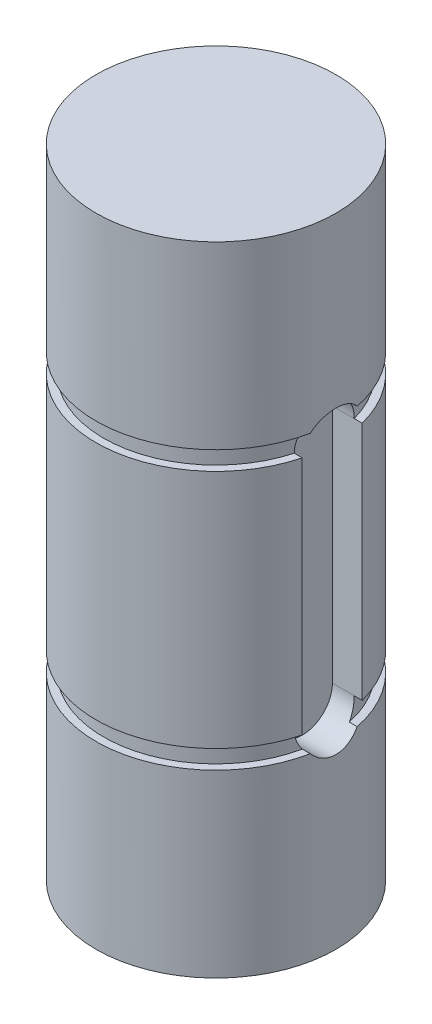
ISO-10303-21;
HEADER;
FILE_DESCRIPTION(('STEP AP214'),'2;1');
FILE_NAME('part.step','',(''),(''),'','','');
FILE_SCHEMA(('AUTOMOTIVE_DESIGN { 1 0 10303 214 1 1 1 1 }'));
ENDSEC;
DATA;
#1=APPLICATION_CONTEXT('core data for automotive mechanical design processes');
#2=APPLICATION_PROTOCOL_DEFINITION('international standard','automotive_design',2000,#1);
#3=PRODUCT_CONTEXT('',#1,'mechanical');
#4=PRODUCT('Part','Part','',(#3));
#5=PRODUCT_RELATED_PRODUCT_CATEGORY('part','',(#4));
#6=PRODUCT_DEFINITION_FORMATION('','',#4);
#7=PRODUCT_DEFINITION_CONTEXT('part definition',#1,'design');
#8=PRODUCT_DEFINITION('design','',#6,#7);
#9=PRODUCT_DEFINITION_SHAPE('','',#8);
#10=(LENGTH_UNIT() NAMED_UNIT(*) SI_UNIT(.MILLI.,.METRE.));
#11=(NAMED_UNIT(*) PLANE_ANGLE_UNIT() SI_UNIT($,.RADIAN.));
#12=(NAMED_UNIT(*) SI_UNIT($,.STERADIAN.) SOLID_ANGLE_UNIT());
#13=UNCERTAINTY_MEASURE_WITH_UNIT(LENGTH_MEASURE(1.E-05),#10,'distance_accuracy_value','');
#14=(GEOMETRIC_REPRESENTATION_CONTEXT(3) GLOBAL_UNCERTAINTY_ASSIGNED_CONTEXT((#13)) GLOBAL_UNIT_ASSIGNED_CONTEXT((#10,
#11,#12)) REPRESENTATION_CONTEXT('',''));
#15=CARTESIAN_POINT('',(0.,0.,0.));
#16=DIRECTION('',(0.,0.,1.));
#17=DIRECTION('',(1.,0.,0.));
#18=AXIS2_PLACEMENT_3D('',#15,#16,#17);
#19=CARTESIAN_POINT('',(0.,13.28,0.));
#20=DIRECTION('',(0.,-1.,0.));
#21=DIRECTION('',(0.,0.,-1.));
#22=AXIS2_PLACEMENT_3D('',#19,#20,#21);
#23=CYLINDRICAL_SURFACE('',#22,2.5);
#24=DIRECTION('',(0.,-1.,0.));
#25=VECTOR('',#24,1.);
#26=CARTESIAN_POINT('',(2.42061459137964,13.28,-0.625));
#27=LINE('',#26,#25);
#28=CARTESIAN_POINT('',(2.42061459137964,4.14,-0.625));
#29=VERTEX_POINT('',#28);
#30=CARTESIAN_POINT('',(2.42061459137964,9.14,-0.625));
#31=VERTEX_POINT('',#30);
#32=EDGE_CURVE('E273',#29,#31,#27,.F.);
#33=ORIENTED_EDGE('',*,*,#32,.F.);
#34=CARTESIAN_POINT('',(0.,4.14,0.));
#35=DIRECTION('',(0.,1.,0.));
#36=DIRECTION('',(0.,0.,1.));
#37=AXIS2_PLACEMENT_3D('',#34,#35,#36);
#38=CIRCLE('',#37,2.5);
#39=CARTESIAN_POINT('',(2.42061459137964,4.14,0.624999999999999));
#40=VERTEX_POINT('',#39);
#41=EDGE_CURVE('E190',#29,#40,#38,.T.);
#42=ORIENTED_EDGE('',*,*,#41,.T.);
#43=DIRECTION('',(0.,-1.,0.));
#44=VECTOR('',#43,1.);
#45=CARTESIAN_POINT('',(2.42061459137964,13.28,0.625000000000001));
#46=LINE('',#45,#44);
#47=CARTESIAN_POINT('',(2.42061459137964,9.14,0.625));
#48=VERTEX_POINT('',#47);
#49=EDGE_CURVE('E276',#40,#48,#46,.F.);
#50=ORIENTED_EDGE('',*,*,#49,.T.);
#51=CARTESIAN_POINT('',(0.,9.14,0.));
#52=DIRECTION('',(0.,-1.,0.));
#53=DIRECTION('',(0.,0.,-1.));
#54=AXIS2_PLACEMENT_3D('',#51,#52,#53);
#55=CIRCLE('',#54,2.5);
#56=EDGE_CURVE('E194',#48,#31,#55,.T.);
#57=ORIENTED_EDGE('',*,*,#56,.T.);
#58=EDGE_LOOP('',(#33,#42,#50,#57));
#59=FACE_BOUND('',#58,.T.);
#60=ADVANCED_FACE('F33',(#59),#23,.T.);
#61=CARTESIAN_POINT('',(0.,9.14,8.78702982031954));
#62=DIRECTION('',(0.,-1.,0.));
#63=DIRECTION('',(0.,0.,-1.));
#64=AXIS2_PLACEMENT_3D('',#61,#62,#63);
#65=PLANE('',#64);
#66=DIRECTION('',(1.,0.,0.));
#67=VECTOR('',#66,1.);
#68=CARTESIAN_POINT('',(1.8,9.14,-0.625));
#69=LINE('',#68,#67);
#70=CARTESIAN_POINT('',(2.25498891349825,9.14,-0.625));
#71=VERTEX_POINT('',#70);
#72=EDGE_CURVE('E145',#71,#31,#69,.T.);
#73=ORIENTED_EDGE('',*,*,#72,.T.);
#74=ORIENTED_EDGE('',*,*,#56,.F.);
#75=DIRECTION('',(1.,0.,0.));
#76=VECTOR('',#75,1.);
#77=CARTESIAN_POINT('',(1.8,9.14,0.625));
#78=LINE('',#77,#76);
#79=CARTESIAN_POINT('',(2.25498891349825,9.14,0.625));
#80=VERTEX_POINT('',#79);
#81=EDGE_CURVE('E124',#80,#48,#78,.T.);
#82=ORIENTED_EDGE('',*,*,#81,.F.);
#83=CARTESIAN_POINT('',(0.,9.14,0.));
#84=DIRECTION('',(0.,1.,0.));
#85=DIRECTION('',(0.,0.,1.));
#86=AXIS2_PLACEMENT_3D('',#83,#84,#85);
#87=CIRCLE('',#86,2.34);
#88=EDGE_CURVE('E201',#71,#80,#87,.T.);
#89=ORIENTED_EDGE('',*,*,#88,.F.);
#90=EDGE_LOOP('',(#73,#74,#82,#89));
#91=FACE_BOUND('',#90,.T.);
#92=ADVANCED_FACE('F247',(#91),#65,.F.);
#93=CARTESIAN_POINT('',(0.,9.53,8.78702982031954));
#94=DIRECTION('',(0.,1.,0.));
#95=DIRECTION('',(0.,0.,1.));
#96=AXIS2_PLACEMENT_3D('',#93,#94,#95);
#97=PLANE('',#96);
#98=CARTESIAN_POINT('',(0.,9.53,0.));
#99=DIRECTION('',(0.,1.,0.));
#100=DIRECTION('',(0.,0.,1.));
#101=AXIS2_PLACEMENT_3D('',#98,#99,#100);
#102=CIRCLE('',#101,2.34);
#103=CARTESIAN_POINT('',(2.28846564317667,9.53,-0.48839021284215));
#104=VERTEX_POINT('',#103);
#105=CARTESIAN_POINT('',(2.28846564317667,9.53,0.48839021284215));
#106=VERTEX_POINT('',#105);
#107=EDGE_CURVE('E189',#104,#106,#102,.T.);
#108=ORIENTED_EDGE('',*,*,#107,.T.);
#109=DIRECTION('',(1.,0.,0.));
#110=VECTOR('',#109,1.);
#111=CARTESIAN_POINT('',(1.8,9.53,0.48839021284215));
#112=LINE('',#111,#110);
#113=CARTESIAN_POINT('',(2.45183094849543,9.53,0.48839021284215));
#114=VERTEX_POINT('',#113);
#115=EDGE_CURVE('E61',#106,#114,#112,.T.);
#116=ORIENTED_EDGE('',*,*,#115,.T.);
#117=CARTESIAN_POINT('',(0.,9.53,0.));
#118=DIRECTION('',(0.,1.,0.));
#119=DIRECTION('',(0.,0.,1.));
#120=AXIS2_PLACEMENT_3D('',#117,#118,#119);
#121=CIRCLE('',#120,2.5);
#122=CARTESIAN_POINT('',(2.45183094849543,9.53,-0.48839021284215));
#123=VERTEX_POINT('',#122);
#124=EDGE_CURVE('E198',#123,#114,#121,.T.);
#125=ORIENTED_EDGE('',*,*,#124,.F.);
#126=DIRECTION('',(1.,0.,0.));
#127=VECTOR('',#126,1.);
#128=CARTESIAN_POINT('',(1.8,9.53,-0.48839021284215));
#129=LINE('',#128,#127);
#130=EDGE_CURVE('E270',#123,#104,#129,.F.);
#131=ORIENTED_EDGE('',*,*,#130,.T.);
#132=EDGE_LOOP('',(#108,#116,#125,#131));
#133=FACE_BOUND('',#132,.T.);
#134=ADVANCED_FACE('F252',(#133),#97,.F.);
#135=CARTESIAN_POINT('',(0.,10.1945053940765,0.));
#136=DIRECTION('',(0.,1.,0.));
#137=DIRECTION('',(0.,0.,1.));
#138=AXIS2_PLACEMENT_3D('',#135,#136,#137);
#139=CYLINDRICAL_SURFACE('',#138,2.34);
#140=ORIENTED_EDGE('',*,*,#88,.T.);
#141=CARTESIAN_POINT('',(2.25498891349825,9.14,0.625));
#142=CARTESIAN_POINT('',(2.2549577676071,9.1749451676806,0.625031242881273));
#143=CARTESIAN_POINT('',(2.25580142119508,9.20986397429771,0.62207010779259));
#144=CARTESIAN_POINT('',(2.2589500737712,9.27770273982781,0.610576459427106));
#145=CARTESIAN_POINT('',(2.26121368163625,9.31065128418251,0.602201551401814));
#146=CARTESIAN_POINT('',(2.26706996716942,9.37611091336742,0.579765859672453));
#147=CARTESIAN_POINT('',(2.27071829563075,9.40853429646581,0.56546430145991));
#148=CARTESIAN_POINT('',(2.27898384198627,9.47137523452277,0.531171536249049));
#149=CARTESIAN_POINT('',(2.28362684375595,9.50170342996703,0.511022506756539));
#150=CARTESIAN_POINT('',(2.28846564317667,9.53,0.488390212842151));
#151=B_SPLINE_CURVE_WITH_KNOTS('',3,(#141,#142,#143,#144,#145,#146,#147,#148,#149,#150),
.UNSPECIFIED.,.F.,.F.,(4,2,2,2,4),(0.,0.104657709850377,0.206398045239264,0.312755280421558,
0.422303330243623),.UNSPECIFIED.);
#152=EDGE_CURVE('E120',#80,#106,#151,.T.);
#153=ORIENTED_EDGE('',*,*,#152,.T.);
#154=ORIENTED_EDGE('',*,*,#107,.F.);
#155=CARTESIAN_POINT('',(2.28846564317667,9.53,-0.48839021284215));
#156=CARTESIAN_POINT('',(2.28377829713318,9.50257325744707,-0.51032107952373));
#157=CARTESIAN_POINT('',(2.27927222148687,9.47324566608614,-0.529922187080843));
#158=CARTESIAN_POINT('',(2.27120447844851,9.41250982613475,-0.563495224923729));
#159=CARTESIAN_POINT('',(2.26761972594627,9.38118377061133,-0.577610547747851));
#160=CARTESIAN_POINT('',(2.26160985513081,9.31597398040031,-0.600727130319745));
#161=CARTESIAN_POINT('',(2.25920557537542,9.28205571516072,-0.609636984124141));
#162=CARTESIAN_POINT('',(2.25585465538172,9.21212239544052,-0.62187813661629));
#163=CARTESIAN_POINT('',(2.25495320411917,9.17607499741546,-0.625036746668475));
#164=CARTESIAN_POINT('',(2.25498891349825,9.14,-0.625));
#165=B_SPLINE_CURVE_WITH_KNOTS('',3,(#155,#156,#157,#158,#159,#160,#161,#162,#163,#164),
.UNSPECIFIED.,.F.,.F.,(4,2,2,2,4),(0.,0.106169432309088,0.209339315428148,0.314270232765198,
0.422302928180428),.UNSPECIFIED.);
#166=EDGE_CURVE('E220',#104,#71,#165,.T.);
#167=ORIENTED_EDGE('',*,*,#166,.T.);
#168=EDGE_LOOP('',(#140,#153,#154,#167));
#169=FACE_BOUND('',#168,.T.);
#170=ADVANCED_FACE('F225',(#169),#139,.T.);
#171=CARTESIAN_POINT('',(0.,13.28,0.));
#172=DIRECTION('',(0.,1.,0.));
#173=DIRECTION('',(0.,0.,1.));
#174=AXIS2_PLACEMENT_3D('',#171,#172,#173);
#175=PLANE('',#174);
#176=CARTESIAN_POINT('',(0.,13.28,0.));
#177=DIRECTION('',(0.,1.,0.));
#178=DIRECTION('',(0.,0.,1.));
#179=AXIS2_PLACEMENT_3D('',#176,#177,#178);
#180=CIRCLE('',#179,2.5);
#181=CARTESIAN_POINT('',(0.,13.28,2.5));
#182=VERTEX_POINT('',#181);
#183=EDGE_CURVE('E185',#182,#182,#180,.T.);
#184=ORIENTED_EDGE('',*,*,#183,.T.);
#185=EDGE_LOOP('',(#184));
#186=FACE_BOUND('',#185,.T.);
#187=ADVANCED_FACE('F258',(#186),#175,.T.);
#188=ORIENTED_EDGE('',*,*,#124,.T.);
#189=CARTESIAN_POINT('',(2.45183094849543,9.53,0.48839021284215));
#190=CARTESIAN_POINT('',(2.45620985079355,9.55751735504364,0.466446135173257));
#191=CARTESIAN_POINT('',(2.46073522955007,9.58313412624469,0.442157383459971));
#192=CARTESIAN_POINT('',(2.46959668145522,9.62996434420629,0.389604143855874));
#193=CARTESIAN_POINT('',(2.47393267692812,9.65117599735066,0.361338044349879));
#194=CARTESIAN_POINT('',(2.48193206156887,9.68858591340279,0.301538034793153));
#195=CARTESIAN_POINT('',(2.48559489195543,9.70478001892035,0.270001443630926));
#196=CARTESIAN_POINT('',(2.49183240360243,9.73162928517735,0.204569439455386));
#197=CARTESIAN_POINT('',(2.49440775858927,9.74228787629207,0.17067550210078));
#198=CARTESIAN_POINT('',(2.49814743480022,9.75759218432348,0.102075270104221));
#199=CARTESIAN_POINT('',(2.49933459123758,9.76233529751457,0.0673919786486274));
#200=CARTESIAN_POINT('',(2.500241728989,9.76596890490676,-0.00230266926770342));
#201=CARTESIAN_POINT('',(2.49996165472389,9.7648591774004,-0.0373140381059678));
#202=CARTESIAN_POINT('',(2.49798767082826,9.75691273910093,-0.105874799248248));
#203=CARTESIAN_POINT('',(2.49632412393997,9.75019900649309,-0.139439444588621));
#204=CARTESIAN_POINT('',(2.49180073116005,9.73142055464127,-0.204959205697209));
#205=CARTESIAN_POINT('',(2.48894057007017,9.7193544254805,-0.236913894902811));
#206=CARTESIAN_POINT('',(2.48228901347954,9.69008064891042,-0.298694706388594));
#207=CARTESIAN_POINT('',(2.47848772354246,9.67281792200079,-0.328493557902189));
#208=CARTESIAN_POINT('',(2.47037297246938,9.63369179076398,-0.384793070669471));
#209=CARTESIAN_POINT('',(2.46606009386891,9.61183359769586,-0.411297414178233));
#210=CARTESIAN_POINT('',(2.4600624671058,9.5788766288402,-0.445178439841576));
#211=CARTESIAN_POINT('',(2.45840021313174,9.56947361533849,-0.454255959435433));
#212=CARTESIAN_POINT('',(2.45509547337905,9.55013335280055,-0.471789471966372));
#213=CARTESIAN_POINT('',(2.45345295711915,9.54019710760064,-0.480246566408103));
#214=CARTESIAN_POINT('',(2.45183094849543,9.53000000000004,-0.488390212842183));
#215=B_SPLINE_CURVE_WITH_KNOTS('',3,(#189,#190,#191,#192,#193,#194,#195,#196,#197,#198,#199,
#200,#201,#202,#203,#204,#205,#206,#207,#208,#209,#210,#211,#212,#213,#214),.UNSPECIFIED.,.F.,
.F.,(4,2,2,2,2,2,2,2,2,2,2,2,4),(0.,0.106271829539023,0.212586844928902,0.318989715642157,
0.425326569252455,0.529888464917011,0.634454321447661,0.736784052545583,0.839140755143274,
0.942623020441692,1.04598856376482,1.08549382972697,1.12492716962117),.UNSPECIFIED.);
#216=EDGE_CURVE('E11',#114,#123,#215,.T.);
#217=ORIENTED_EDGE('',*,*,#216,.T.);
#218=EDGE_LOOP('',(#188,#217));
#219=FACE_BOUND('',#218,.T.);
#220=ORIENTED_EDGE('',*,*,#183,.F.);
#221=EDGE_LOOP('',(#220));
#222=FACE_BOUND('',#221,.T.);
#223=ADVANCED_FACE('F35',(#219,#222),#23,.T.);
#224=CARTESIAN_POINT('',(0.,3.75,8.95069799539655));
#225=DIRECTION('',(0.,-1.,0.));
#226=DIRECTION('',(0.,0.,-1.));
#227=AXIS2_PLACEMENT_3D('',#224,#225,#226);
#228=PLANE('',#227);
#229=CARTESIAN_POINT('',(0.,3.75,0.));
#230=DIRECTION('',(0.,1.,0.));
#231=DIRECTION('',(0.,0.,1.));
#232=AXIS2_PLACEMENT_3D('',#229,#230,#231);
#233=CIRCLE('',#232,2.34);
#234=CARTESIAN_POINT('',(2.28846564317667,3.75,-0.48839021284215));
#235=VERTEX_POINT('',#234);
#236=CARTESIAN_POINT('',(2.28846564317667,3.75,0.48839021284215));
#237=VERTEX_POINT('',#236);
#238=EDGE_CURVE('E193',#235,#237,#233,.T.);
#239=ORIENTED_EDGE('',*,*,#238,.F.);
#240=DIRECTION('',(1.,0.,0.));
#241=VECTOR('',#240,1.);
#242=CARTESIAN_POINT('',(1.8,3.75,-0.48839021284215));
#243=LINE('',#242,#241);
#244=CARTESIAN_POINT('',(2.45183094849543,3.75,-0.488390212842153));
#245=VERTEX_POINT('',#244);
#246=EDGE_CURVE('E152',#235,#245,#243,.T.);
#247=ORIENTED_EDGE('',*,*,#246,.T.);
#248=CARTESIAN_POINT('',(0.,3.75,0.));
#249=DIRECTION('',(0.,-1.,0.));
#250=DIRECTION('',(0.,0.,-1.));
#251=AXIS2_PLACEMENT_3D('',#248,#249,#250);
#252=CIRCLE('',#251,2.5);
#253=CARTESIAN_POINT('',(2.45183094849543,3.75,0.48839021284215));
#254=VERTEX_POINT('',#253);
#255=EDGE_CURVE('E186',#254,#245,#252,.T.);
#256=ORIENTED_EDGE('',*,*,#255,.F.);
#257=DIRECTION('',(1.,0.,0.));
#258=VECTOR('',#257,1.);
#259=CARTESIAN_POINT('',(1.8,3.75,0.48839021284215));
#260=LINE('',#259,#258);
#261=EDGE_CURVE('E53',#254,#237,#260,.F.);
#262=ORIENTED_EDGE('',*,*,#261,.T.);
#263=EDGE_LOOP('',(#239,#247,#256,#262));
#264=FACE_BOUND('',#263,.T.);
#265=ADVANCED_FACE('F236',(#264),#228,.F.);
#266=CARTESIAN_POINT('',(0.,4.14,8.95069799539655));
#267=DIRECTION('',(0.,1.,0.));
#268=DIRECTION('',(0.,0.,1.));
#269=AXIS2_PLACEMENT_3D('',#266,#267,#268);
#270=PLANE('',#269);
#271=ORIENTED_EDGE('',*,*,#41,.F.);
#272=DIRECTION('',(1.,0.,0.));
#273=VECTOR('',#272,1.);
#274=CARTESIAN_POINT('',(1.8,4.14,-0.625));
#275=LINE('',#274,#273);
#276=CARTESIAN_POINT('',(2.25498891349825,4.14,-0.625));
#277=VERTEX_POINT('',#276);
#278=EDGE_CURVE('E149',#277,#29,#275,.T.);
#279=ORIENTED_EDGE('',*,*,#278,.F.);
#280=CARTESIAN_POINT('',(0.,4.14,0.));
#281=DIRECTION('',(0.,1.,0.));
#282=DIRECTION('',(0.,0.,1.));
#283=AXIS2_PLACEMENT_3D('',#280,#281,#282);
#284=CIRCLE('',#283,2.34);
#285=CARTESIAN_POINT('',(2.25498891349825,4.14,0.624999999999999));
#286=VERTEX_POINT('',#285);
#287=EDGE_CURVE('E212',#277,#286,#284,.T.);
#288=ORIENTED_EDGE('',*,*,#287,.T.);
#289=DIRECTION('',(1.,0.,0.));
#290=VECTOR('',#289,1.);
#291=CARTESIAN_POINT('',(1.8,4.14,0.624999999999999));
#292=LINE('',#291,#290);
#293=EDGE_CURVE('E123',#286,#40,#292,.T.);
#294=ORIENTED_EDGE('',*,*,#293,.T.);
#295=EDGE_LOOP('',(#271,#279,#288,#294));
#296=FACE_BOUND('',#295,.T.);
#297=ADVANCED_FACE('F232',(#296),#270,.F.);
#298=CARTESIAN_POINT('',(0.,6.07806317007392,0.));
#299=DIRECTION('',(0.,1.,0.));
#300=DIRECTION('',(0.,0.,1.));
#301=AXIS2_PLACEMENT_3D('',#298,#299,#300);
#302=CYLINDRICAL_SURFACE('',#301,2.34);
#303=ORIENTED_EDGE('',*,*,#238,.T.);
#304=CARTESIAN_POINT('',(2.28846564317667,3.75,0.48839021284215));
#305=CARTESIAN_POINT('',(2.28377829713318,3.77742674255293,0.51032107952373));
#306=CARTESIAN_POINT('',(2.27927222148687,3.80675433391386,0.529922187080844));
#307=CARTESIAN_POINT('',(2.27120447844851,3.86749017386526,0.56349522492373));
#308=CARTESIAN_POINT('',(2.26761972594627,3.89881622938867,0.577610547747851));
#309=CARTESIAN_POINT('',(2.26160985513081,3.96402601959969,0.600727130319745));
#310=CARTESIAN_POINT('',(2.25920557537542,3.99794428483928,0.609636984124141));
#311=CARTESIAN_POINT('',(2.25585465538172,4.06787760455948,0.62187813661629));
#312=CARTESIAN_POINT('',(2.25495320411917,4.10392500258454,0.625036746668475));
#313=CARTESIAN_POINT('',(2.25498891349825,4.14,0.625));
#314=B_SPLINE_CURVE_WITH_KNOTS('',3,(#304,#305,#306,#307,#308,#309,#310,#311,#312,#313),
.UNSPECIFIED.,.F.,.F.,(4,2,2,2,4),(0.,0.106169432309089,0.20933931542815,0.314270232765197,
0.422302928180428),.UNSPECIFIED.);
#315=EDGE_CURVE('E163',#237,#286,#314,.T.);
#316=ORIENTED_EDGE('',*,*,#315,.T.);
#317=ORIENTED_EDGE('',*,*,#287,.F.);
#318=CARTESIAN_POINT('',(2.25498891349825,4.14,-0.625));
#319=CARTESIAN_POINT('',(2.2549577676071,4.1050548323194,-0.625031242881273));
#320=CARTESIAN_POINT('',(2.25580142119508,4.07013602570229,-0.62207010779259));
#321=CARTESIAN_POINT('',(2.25895007377119,4.0022972601722,-0.610576459427107));
#322=CARTESIAN_POINT('',(2.26121368163625,3.96934871581749,-0.602201551401814));
#323=CARTESIAN_POINT('',(2.26706996716942,3.90388908663258,-0.579765859672453));
#324=CARTESIAN_POINT('',(2.27071829563075,3.87146570353419,-0.56546430145991));
#325=CARTESIAN_POINT('',(2.27898384198626,3.80862476547723,-0.531171536249049));
#326=CARTESIAN_POINT('',(2.28362684375595,3.77829657003297,-0.511022506756539));
#327=CARTESIAN_POINT('',(2.28846564317667,3.75,-0.48839021284215));
#328=B_SPLINE_CURVE_WITH_KNOTS('',3,(#318,#319,#320,#321,#322,#323,#324,#325,#326,#327),
.UNSPECIFIED.,.F.,.F.,(4,2,2,2,4),(0.,0.104657709850376,0.206398045239264,0.312755280421561,
0.422303330243625),.UNSPECIFIED.);
#329=EDGE_CURVE('E155',#277,#235,#328,.T.);
#330=ORIENTED_EDGE('',*,*,#329,.T.);
#331=EDGE_LOOP('',(#303,#316,#317,#330));
#332=FACE_BOUND('',#331,.T.);
#333=ADVANCED_FACE('F168',(#332),#302,.T.);
#334=CARTESIAN_POINT('',(0.,0.,0.));
#335=DIRECTION('',(0.,1.,0.));
#336=DIRECTION('',(0.,0.,1.));
#337=AXIS2_PLACEMENT_3D('',#334,#335,#336);
#338=PLANE('',#337);
#339=CARTESIAN_POINT('',(0.,0.,0.));
#340=DIRECTION('',(0.,1.,0.));
#341=DIRECTION('',(0.,0.,1.));
#342=AXIS2_PLACEMENT_3D('',#339,#340,#341);
#343=CIRCLE('',#342,2.5);
#344=CARTESIAN_POINT('',(0.,0.,2.5));
#345=VERTEX_POINT('',#344);
#346=EDGE_CURVE('E197',#345,#345,#343,.T.);
#347=ORIENTED_EDGE('',*,*,#346,.F.);
#348=EDGE_LOOP('',(#347));
#349=FACE_BOUND('',#348,.T.);
#350=ADVANCED_FACE('F242',(#349),#338,.F.);
#351=ORIENTED_EDGE('',*,*,#255,.T.);
#352=CARTESIAN_POINT('',(2.45183094849543,3.75,-0.488390212842153));
#353=CARTESIAN_POINT('',(2.45620985079355,3.72248264495636,-0.46644613517326));
#354=CARTESIAN_POINT('',(2.46073522955007,3.69686587375532,-0.442157383459974));
#355=CARTESIAN_POINT('',(2.46959668145522,3.65003565579371,-0.389604143855878));
#356=CARTESIAN_POINT('',(2.47393267692812,3.62882400264935,-0.361338044349883));
#357=CARTESIAN_POINT('',(2.48193206156887,3.59141408659721,-0.301538034793157));
#358=CARTESIAN_POINT('',(2.48559489195543,3.57521998107965,-0.27000144363093));
#359=CARTESIAN_POINT('',(2.49183240360243,3.54837071482265,-0.20456943945539));
#360=CARTESIAN_POINT('',(2.49440775858927,3.53771212370793,-0.170675502100784));
#361=CARTESIAN_POINT('',(2.49814743480022,3.52240781567652,-0.102075270104225));
#362=CARTESIAN_POINT('',(2.49933459123758,3.51766470248543,-0.0673919786486318));
#363=CARTESIAN_POINT('',(2.500241728989,3.51403109509324,0.00230266926769905));
#364=CARTESIAN_POINT('',(2.49996165472389,3.5151408225996,0.0373140381059635));
#365=CARTESIAN_POINT('',(2.49798767082826,3.52308726089907,0.105874799248243));
#366=CARTESIAN_POINT('',(2.49632412393997,3.52980099350691,0.139439444588616));
#367=CARTESIAN_POINT('',(2.49180073116005,3.54857944535873,0.204959205697205));
#368=CARTESIAN_POINT('',(2.48894057007017,3.5606455745195,0.236913894902807));
#369=CARTESIAN_POINT('',(2.48228901347954,3.58991935108957,0.29869470638859));
#370=CARTESIAN_POINT('',(2.47848772354246,3.60718207799921,0.328493557902184));
#371=CARTESIAN_POINT('',(2.47037297246938,3.64630820923602,0.384793070669467));
#372=CARTESIAN_POINT('',(2.46606009386891,3.66816640230414,0.411297414178229));
#373=CARTESIAN_POINT('',(2.4600624671058,3.70112337115979,0.445178439841574));
#374=CARTESIAN_POINT('',(2.45840021313174,3.71052638466151,0.454255959435432));
#375=CARTESIAN_POINT('',(2.45509547337905,3.72986664719945,0.471789471966373));
#376=CARTESIAN_POINT('',(2.45345295711915,3.73980289239937,0.480246566408105));
#377=CARTESIAN_POINT('',(2.45183094849543,3.74999999999997,0.488390212842186));
#378=B_SPLINE_CURVE_WITH_KNOTS('',3,(#352,#353,#354,#355,#356,#357,#358,#359,#360,#361,#362,
#363,#364,#365,#366,#367,#368,#369,#370,#371,#372,#373,#374,#375,#376,#377),.UNSPECIFIED.,.F.,
.F.,(4,2,2,2,2,2,2,2,2,2,2,2,4),(0.,0.106271829539023,0.212586844928901,0.318989715642159,
0.425326569252455,0.529888464917011,0.634454321447661,0.736784052545583,0.839140755143274,
0.942623020441692,1.04598856376482,1.08549382972697,1.12492716962118),.UNSPECIFIED.);
#379=EDGE_CURVE('E46',#245,#254,#378,.T.);
#380=ORIENTED_EDGE('',*,*,#379,.T.);
#381=EDGE_LOOP('',(#351,#380));
#382=FACE_BOUND('',#381,.T.);
#383=ORIENTED_EDGE('',*,*,#346,.T.);
#384=EDGE_LOOP('',(#383));
#385=FACE_BOUND('',#384,.T.);
#386=ADVANCED_FACE('F231',(#382,#385),#23,.T.);
#387=CARTESIAN_POINT('',(1.8,9.14,0.));
#388=DIRECTION('',(1.,0.,0.));
#389=DIRECTION('',(0.,0.,-1.));
#390=AXIS2_PLACEMENT_3D('',#387,#388,#389);
#391=CYLINDRICAL_SURFACE('',#390,0.625);
#392=CARTESIAN_POINT('',(1.8,9.14,0.625));
#393=VERTEX_POINT('',#392);
#394=EDGE_CURVE('E114',#393,#80,#78,.T.);
#395=ORIENTED_EDGE('',*,*,#394,.F.);
#396=CARTESIAN_POINT('',(1.8,9.14,0.));
#397=DIRECTION('',(1.,0.,0.));
#398=DIRECTION('',(0.,0.,-1.));
#399=AXIS2_PLACEMENT_3D('',#396,#397,#398);
#400=CIRCLE('',#399,0.625);
#401=CARTESIAN_POINT('',(1.8,9.14,-0.625));
#402=VERTEX_POINT('',#401);
#403=EDGE_CURVE('E119',#402,#393,#400,.T.);
#404=ORIENTED_EDGE('',*,*,#403,.F.);
#405=EDGE_CURVE('E143',#402,#71,#69,.T.);
#406=ORIENTED_EDGE('',*,*,#405,.T.);
#407=ORIENTED_EDGE('',*,*,#166,.F.);
#408=ORIENTED_EDGE('',*,*,#130,.F.);
#409=ORIENTED_EDGE('',*,*,#216,.F.);
#410=ORIENTED_EDGE('',*,*,#115,.F.);
#411=ORIENTED_EDGE('',*,*,#152,.F.);
#412=EDGE_LOOP('',(#395,#404,#406,#407,#408,#409,#410,#411));
#413=FACE_BOUND('',#412,.T.);
#414=ADVANCED_FACE('F116',(#413),#391,.F.);
#415=CARTESIAN_POINT('',(1.8,9.14,-0.625));
#416=DIRECTION('',(0.,0.,1.));
#417=DIRECTION('',(0.,-1.,0.));
#418=AXIS2_PLACEMENT_3D('',#415,#416,#417);
#419=PLANE('',#418);
#420=ORIENTED_EDGE('',*,*,#32,.T.);
#421=ORIENTED_EDGE('',*,*,#72,.F.);
#422=ORIENTED_EDGE('',*,*,#405,.F.);
#423=DIRECTION('',(0.,-1.,0.));
#424=VECTOR('',#423,1.);
#425=CARTESIAN_POINT('',(1.8,9.14,-0.625));
#426=LINE('',#425,#424);
#427=CARTESIAN_POINT('',(1.8,4.14,-0.625));
#428=VERTEX_POINT('',#427);
#429=EDGE_CURVE('E138',#402,#428,#426,.T.);
#430=ORIENTED_EDGE('',*,*,#429,.T.);
#431=EDGE_CURVE('E146',#428,#277,#275,.T.);
#432=ORIENTED_EDGE('',*,*,#431,.T.);
#433=ORIENTED_EDGE('',*,*,#278,.T.);
#434=EDGE_LOOP('',(#420,#421,#422,#430,#432,#433));
#435=FACE_BOUND('',#434,.T.);
#436=ADVANCED_FACE('F177',(#435),#419,.T.);
#437=CARTESIAN_POINT('',(1.8,9.14,0.625));
#438=DIRECTION('',(0.,0.,1.));
#439=DIRECTION('',(0.,-1.,0.));
#440=AXIS2_PLACEMENT_3D('',#437,#438,#439);
#441=PLANE('',#440);
#442=ORIENTED_EDGE('',*,*,#293,.F.);
#443=CARTESIAN_POINT('',(1.8,4.14,0.624999999999999));
#444=VERTEX_POINT('',#443);
#445=EDGE_CURVE('E130',#444,#286,#292,.T.);
#446=ORIENTED_EDGE('',*,*,#445,.F.);
#447=DIRECTION('',(0.,-1.,0.));
#448=VECTOR('',#447,1.);
#449=CARTESIAN_POINT('',(1.8,9.14,0.625));
#450=LINE('',#449,#448);
#451=EDGE_CURVE('E127',#393,#444,#450,.T.);
#452=ORIENTED_EDGE('',*,*,#451,.F.);
#453=ORIENTED_EDGE('',*,*,#394,.T.);
#454=ORIENTED_EDGE('',*,*,#81,.T.);
#455=ORIENTED_EDGE('',*,*,#49,.F.);
#456=EDGE_LOOP('',(#442,#446,#452,#453,#454,#455));
#457=FACE_BOUND('',#456,.T.);
#458=ADVANCED_FACE('F128',(#457),#441,.F.);
#459=CARTESIAN_POINT('',(1.8,4.14,0.));
#460=DIRECTION('',(1.,0.,0.));
#461=DIRECTION('',(0.,0.,-1.));
#462=AXIS2_PLACEMENT_3D('',#459,#460,#461);
#463=CYLINDRICAL_SURFACE('',#462,0.625);
#464=ORIENTED_EDGE('',*,*,#261,.F.);
#465=ORIENTED_EDGE('',*,*,#379,.F.);
#466=ORIENTED_EDGE('',*,*,#246,.F.);
#467=ORIENTED_EDGE('',*,*,#329,.F.);
#468=ORIENTED_EDGE('',*,*,#431,.F.);
#469=CARTESIAN_POINT('',(1.8,4.14,0.));
#470=DIRECTION('',(1.,0.,0.));
#471=DIRECTION('',(0.,0.,-1.));
#472=AXIS2_PLACEMENT_3D('',#469,#470,#471);
#473=CIRCLE('',#472,0.625);
#474=EDGE_CURVE('E134',#444,#428,#473,.T.);
#475=ORIENTED_EDGE('',*,*,#474,.F.);
#476=ORIENTED_EDGE('',*,*,#445,.T.);
#477=ORIENTED_EDGE('',*,*,#315,.F.);
#478=EDGE_LOOP('',(#464,#465,#466,#467,#468,#475,#476,#477));
#479=FACE_BOUND('',#478,.T.);
#480=ADVANCED_FACE('F172',(#479),#463,.F.);
#481=CARTESIAN_POINT('',(1.8,9.14,0.));
#482=DIRECTION('',(1.,0.,0.));
#483=DIRECTION('',(0.,0.,-1.));
#484=AXIS2_PLACEMENT_3D('',#481,#482,#483);
#485=PLANE('',#484);
#486=ORIENTED_EDGE('',*,*,#403,.T.);
#487=ORIENTED_EDGE('',*,*,#451,.T.);
#488=ORIENTED_EDGE('',*,*,#474,.T.);
#489=ORIENTED_EDGE('',*,*,#429,.F.);
#490=EDGE_LOOP('',(#486,#487,#488,#489));
#491=FACE_BOUND('',#490,.T.);
#492=ADVANCED_FACE('F137',(#491),#485,.T.);
#493=CLOSED_SHELL('',(#60,#92,#134,#170,#187,#223,#265,#297,#333,#350,#386,#414,#436,#458,#480,#492));
#494=MANIFOLD_SOLID_BREP('B2',#493);
#495=ADVANCED_BREP_SHAPE_REPRESENTATION('',(#18,#494),#14);
#496=SHAPE_DEFINITION_REPRESENTATION(#9,#495);
ENDSEC;
END-ISO-10303-21;
